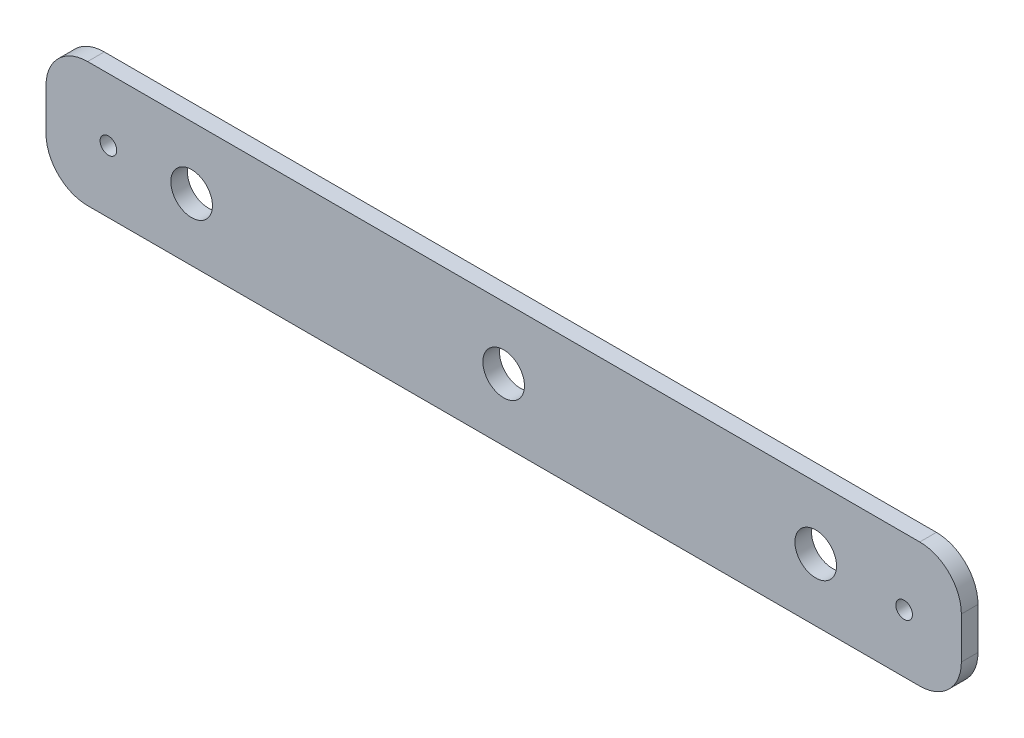
ISO-10303-21;
HEADER;
FILE_DESCRIPTION(('STEP AP214'),'2;1');
FILE_NAME('part.step','',(''),(''),'','','');
FILE_SCHEMA(('AUTOMOTIVE_DESIGN { 1 0 10303 214 1 1 1 1 }'));
ENDSEC;
DATA;
#1=APPLICATION_CONTEXT('core data for automotive mechanical design processes');
#2=APPLICATION_PROTOCOL_DEFINITION('international standard','automotive_design',2000,#1);
#3=PRODUCT_CONTEXT('',#1,'mechanical');
#4=PRODUCT('Part','Part','',(#3));
#5=PRODUCT_RELATED_PRODUCT_CATEGORY('part','',(#4));
#6=PRODUCT_DEFINITION_FORMATION('','',#4);
#7=PRODUCT_DEFINITION_CONTEXT('part definition',#1,'design');
#8=PRODUCT_DEFINITION('design','',#6,#7);
#9=PRODUCT_DEFINITION_SHAPE('','',#8);
#10=(LENGTH_UNIT() NAMED_UNIT(*) SI_UNIT(.MILLI.,.METRE.));
#11=(NAMED_UNIT(*) PLANE_ANGLE_UNIT() SI_UNIT($,.RADIAN.));
#12=(NAMED_UNIT(*) SI_UNIT($,.STERADIAN.) SOLID_ANGLE_UNIT());
#13=UNCERTAINTY_MEASURE_WITH_UNIT(LENGTH_MEASURE(1.E-05),#10,'distance_accuracy_value','');
#14=(GEOMETRIC_REPRESENTATION_CONTEXT(3) GLOBAL_UNCERTAINTY_ASSIGNED_CONTEXT((#13)) GLOBAL_UNIT_ASSIGNED_CONTEXT((#10,
#11,#12)) REPRESENTATION_CONTEXT('',''));
#15=CARTESIAN_POINT('',(0.,0.,0.));
#16=DIRECTION('',(0.,0.,1.));
#17=DIRECTION('',(1.,0.,0.));
#18=AXIS2_PLACEMENT_3D('',#15,#16,#17);
#19=CARTESIAN_POINT('',(0.,0.,4.));
#20=DIRECTION('',(0.,0.,-1.));
#21=DIRECTION('',(-1.,0.,0.));
#22=AXIS2_PLACEMENT_3D('',#19,#20,#21);
#23=PLANE('',#22);
#24=CARTESIAN_POINT('',(-185.,-15.,4.));
#25=DIRECTION('',(0.,0.,1.));
#26=DIRECTION('',(1.,0.,0.));
#27=AXIS2_PLACEMENT_3D('',#24,#25,#26);
#28=CIRCLE('',#27,4.99999999999999);
#29=CARTESIAN_POINT('',(-180.,-15.,4.));
#30=VERTEX_POINT('',#29);
#31=EDGE_CURVE('E165',#30,#30,#28,.T.);
#32=ORIENTED_EDGE('',*,*,#31,.F.);
#33=EDGE_LOOP('',(#32));
#34=FACE_BOUND('',#33,.T.);
#35=CARTESIAN_POINT('',(-110.,-15.,4.));
#36=DIRECTION('',(0.,0.,1.));
#37=DIRECTION('',(1.,0.,0.));
#38=AXIS2_PLACEMENT_3D('',#35,#36,#37);
#39=CIRCLE('',#38,5.);
#40=CARTESIAN_POINT('',(-105.,-15.,4.));
#41=VERTEX_POINT('',#40);
#42=EDGE_CURVE('E349',#41,#41,#39,.T.);
#43=ORIENTED_EDGE('',*,*,#42,.F.);
#44=EDGE_LOOP('',(#43));
#45=FACE_BOUND('',#44,.T.);
#46=CARTESIAN_POINT('',(-35.,-15.,4.));
#47=DIRECTION('',(0.,0.,1.));
#48=DIRECTION('',(1.,0.,0.));
#49=AXIS2_PLACEMENT_3D('',#46,#47,#48);
#50=CIRCLE('',#49,5.);
#51=CARTESIAN_POINT('',(-30.,-15.,4.));
#52=VERTEX_POINT('',#51);
#53=EDGE_CURVE('E352',#52,#52,#50,.T.);
#54=ORIENTED_EDGE('',*,*,#53,.F.);
#55=EDGE_LOOP('',(#54));
#56=FACE_BOUND('',#55,.T.);
#57=DIRECTION('',(0.,1.,0.));
#58=VECTOR('',#57,1.);
#59=CARTESIAN_POINT('',(0.,0.,4.));
#60=LINE('',#59,#58);
#61=CARTESIAN_POINT('',(0.,-20.,4.));
#62=VERTEX_POINT('',#61);
#63=CARTESIAN_POINT('',(0.,-10.,4.));
#64=VERTEX_POINT('',#63);
#65=EDGE_CURVE('E139',#62,#64,#60,.T.);
#66=ORIENTED_EDGE('',*,*,#65,.T.);
#67=CARTESIAN_POINT('',(-10.,-10.,4.));
#68=DIRECTION('',(0.,0.,-1.));
#69=DIRECTION('',(-1.,0.,0.));
#70=AXIS2_PLACEMENT_3D('',#67,#68,#69);
#71=CIRCLE('',#70,10.);
#72=CARTESIAN_POINT('',(-10.,0.,4.));
#73=VERTEX_POINT('',#72);
#74=EDGE_CURVE('E154',#64,#73,#71,.F.);
#75=ORIENTED_EDGE('',*,*,#74,.T.);
#76=DIRECTION('',(-1.,0.,0.));
#77=VECTOR('',#76,1.);
#78=CARTESIAN_POINT('',(0.,0.,4.));
#79=LINE('',#78,#77);
#80=CARTESIAN_POINT('',(-210.,0.,4.));
#81=VERTEX_POINT('',#80);
#82=EDGE_CURVE('E121',#73,#81,#79,.T.);
#83=ORIENTED_EDGE('',*,*,#82,.T.);
#84=CARTESIAN_POINT('',(-210.,-10.,4.));
#85=DIRECTION('',(0.,0.,-1.));
#86=DIRECTION('',(-1.,0.,0.));
#87=AXIS2_PLACEMENT_3D('',#84,#85,#86);
#88=CIRCLE('',#87,10.);
#89=CARTESIAN_POINT('',(-220.,-10.,4.));
#90=VERTEX_POINT('',#89);
#91=EDGE_CURVE('E149',#81,#90,#88,.F.);
#92=ORIENTED_EDGE('',*,*,#91,.T.);
#93=DIRECTION('',(0.,-1.,0.));
#94=VECTOR('',#93,1.);
#95=CARTESIAN_POINT('',(-220.,0.,4.));
#96=LINE('',#95,#94);
#97=CARTESIAN_POINT('',(-220.,-20.,4.));
#98=VERTEX_POINT('',#97);
#99=EDGE_CURVE('E189',#90,#98,#96,.T.);
#100=ORIENTED_EDGE('',*,*,#99,.T.);
#101=CARTESIAN_POINT('',(-210.,-20.,4.));
#102=DIRECTION('',(0.,0.,-1.));
#103=DIRECTION('',(-1.,0.,0.));
#104=AXIS2_PLACEMENT_3D('',#101,#102,#103);
#105=CIRCLE('',#104,10.);
#106=CARTESIAN_POINT('',(-210.,-30.,4.));
#107=VERTEX_POINT('',#106);
#108=EDGE_CURVE('E57',#98,#107,#105,.F.);
#109=ORIENTED_EDGE('',*,*,#108,.T.);
#110=DIRECTION('',(1.,0.,0.));
#111=VECTOR('',#110,1.);
#112=CARTESIAN_POINT('',(0.,-30.,4.));
#113=LINE('',#112,#111);
#114=CARTESIAN_POINT('',(-10.,-30.,4.));
#115=VERTEX_POINT('',#114);
#116=EDGE_CURVE('E140',#107,#115,#113,.T.);
#117=ORIENTED_EDGE('',*,*,#116,.T.);
#118=CARTESIAN_POINT('',(-10.,-20.,4.));
#119=DIRECTION('',(0.,0.,-1.));
#120=DIRECTION('',(-1.,0.,0.));
#121=AXIS2_PLACEMENT_3D('',#118,#119,#120);
#122=CIRCLE('',#121,10.);
#123=EDGE_CURVE('E152',#115,#62,#122,.F.);
#124=ORIENTED_EDGE('',*,*,#123,.T.);
#125=EDGE_LOOP('',(#66,#75,#83,#92,#100,#109,#117,#124));
#126=FACE_BOUND('',#125,.T.);
#127=CARTESIAN_POINT('',(-205.,-15.,4.));
#128=DIRECTION('',(0.,0.,1.));
#129=DIRECTION('',(1.,0.,0.));
#130=AXIS2_PLACEMENT_3D('',#127,#128,#129);
#131=CIRCLE('',#130,2.);
#132=CARTESIAN_POINT('',(-203.,-15.,4.));
#133=VERTEX_POINT('',#132);
#134=EDGE_CURVE('E134',#133,#133,#131,.T.);
#135=ORIENTED_EDGE('',*,*,#134,.F.);
#136=EDGE_LOOP('',(#135));
#137=FACE_BOUND('',#136,.T.);
#138=CARTESIAN_POINT('',(-13.75,-16.,4.));
#139=DIRECTION('',(0.,0.,1.));
#140=DIRECTION('',(1.,0.,0.));
#141=AXIS2_PLACEMENT_3D('',#138,#139,#140);
#142=CIRCLE('',#141,2.);
#143=CARTESIAN_POINT('',(-11.75,-16.,4.));
#144=VERTEX_POINT('',#143);
#145=EDGE_CURVE('E174',#144,#144,#142,.T.);
#146=ORIENTED_EDGE('',*,*,#145,.F.);
#147=EDGE_LOOP('',(#146));
#148=FACE_BOUND('',#147,.T.);
#149=ADVANCED_FACE('F33',(#34,#45,#56,#126,#137,#148),#23,.F.);
#150=CARTESIAN_POINT('',(0.,0.,0.));
#151=DIRECTION('',(0.,0.,-1.));
#152=DIRECTION('',(-1.,0.,0.));
#153=AXIS2_PLACEMENT_3D('',#150,#151,#152);
#154=PLANE('',#153);
#155=CARTESIAN_POINT('',(-185.,-15.,0.));
#156=DIRECTION('',(0.,0.,-1.));
#157=DIRECTION('',(-1.,0.,0.));
#158=AXIS2_PLACEMENT_3D('',#155,#156,#157);
#159=CIRCLE('',#158,4.99999999999999);
#160=CARTESIAN_POINT('',(-190.,-15.,0.));
#161=VERTEX_POINT('',#160);
#162=EDGE_CURVE('E37',#161,#161,#159,.T.);
#163=ORIENTED_EDGE('',*,*,#162,.F.);
#164=EDGE_LOOP('',(#163));
#165=FACE_BOUND('',#164,.T.);
#166=CARTESIAN_POINT('',(-110.,-15.,0.));
#167=DIRECTION('',(0.,0.,-1.));
#168=DIRECTION('',(-1.,0.,0.));
#169=AXIS2_PLACEMENT_3D('',#166,#167,#168);
#170=CIRCLE('',#169,5.);
#171=CARTESIAN_POINT('',(-115.,-15.,0.));
#172=VERTEX_POINT('',#171);
#173=EDGE_CURVE('E164',#172,#172,#170,.T.);
#174=ORIENTED_EDGE('',*,*,#173,.F.);
#175=EDGE_LOOP('',(#174));
#176=FACE_BOUND('',#175,.T.);
#177=CARTESIAN_POINT('',(-35.,-15.,0.));
#178=DIRECTION('',(0.,0.,-1.));
#179=DIRECTION('',(-1.,0.,0.));
#180=AXIS2_PLACEMENT_3D('',#177,#178,#179);
#181=CIRCLE('',#180,5.);
#182=CARTESIAN_POINT('',(-40.,-15.,0.));
#183=VERTEX_POINT('',#182);
#184=EDGE_CURVE('E162',#183,#183,#181,.T.);
#185=ORIENTED_EDGE('',*,*,#184,.F.);
#186=EDGE_LOOP('',(#185));
#187=FACE_BOUND('',#186,.T.);
#188=CARTESIAN_POINT('',(-205.,-15.,0.));
#189=DIRECTION('',(0.,0.,1.));
#190=DIRECTION('',(1.,0.,0.));
#191=AXIS2_PLACEMENT_3D('',#188,#189,#190);
#192=CIRCLE('',#191,2.);
#193=CARTESIAN_POINT('',(-203.,-15.,0.));
#194=VERTEX_POINT('',#193);
#195=EDGE_CURVE('E178',#194,#194,#192,.T.);
#196=ORIENTED_EDGE('',*,*,#195,.T.);
#197=EDGE_LOOP('',(#196));
#198=FACE_BOUND('',#197,.T.);
#199=DIRECTION('',(-1.,0.,0.));
#200=VECTOR('',#199,1.);
#201=CARTESIAN_POINT('',(0.,0.,0.));
#202=LINE('',#201,#200);
#203=CARTESIAN_POINT('',(-10.,0.,0.));
#204=VERTEX_POINT('',#203);
#205=CARTESIAN_POINT('',(-210.,0.,0.));
#206=VERTEX_POINT('',#205);
#207=EDGE_CURVE('E118',#204,#206,#202,.T.);
#208=ORIENTED_EDGE('',*,*,#207,.F.);
#209=CARTESIAN_POINT('',(-10.,-10.,0.));
#210=DIRECTION('',(0.,0.,-1.));
#211=DIRECTION('',(-1.,0.,0.));
#212=AXIS2_PLACEMENT_3D('',#209,#210,#211);
#213=CIRCLE('',#212,10.);
#214=CARTESIAN_POINT('',(0.,-10.,0.));
#215=VERTEX_POINT('',#214);
#216=EDGE_CURVE('E101',#204,#215,#213,.T.);
#217=ORIENTED_EDGE('',*,*,#216,.T.);
#218=DIRECTION('',(0.,1.,0.));
#219=VECTOR('',#218,1.);
#220=CARTESIAN_POINT('',(0.,0.,0.));
#221=LINE('',#220,#219);
#222=CARTESIAN_POINT('',(0.,-20.,0.));
#223=VERTEX_POINT('',#222);
#224=EDGE_CURVE('E129',#223,#215,#221,.T.);
#225=ORIENTED_EDGE('',*,*,#224,.F.);
#226=CARTESIAN_POINT('',(-10.,-20.,0.));
#227=DIRECTION('',(0.,0.,-1.));
#228=DIRECTION('',(-1.,0.,0.));
#229=AXIS2_PLACEMENT_3D('',#226,#227,#228);
#230=CIRCLE('',#229,10.);
#231=CARTESIAN_POINT('',(-10.,-30.,0.));
#232=VERTEX_POINT('',#231);
#233=EDGE_CURVE('E112',#223,#232,#230,.T.);
#234=ORIENTED_EDGE('',*,*,#233,.T.);
#235=DIRECTION('',(1.,0.,0.));
#236=VECTOR('',#235,1.);
#237=CARTESIAN_POINT('',(0.,-30.,0.));
#238=LINE('',#237,#236);
#239=CARTESIAN_POINT('',(-210.,-30.,0.));
#240=VERTEX_POINT('',#239);
#241=EDGE_CURVE('E132',#240,#232,#238,.T.);
#242=ORIENTED_EDGE('',*,*,#241,.F.);
#243=CARTESIAN_POINT('',(-210.,-20.,0.));
#244=DIRECTION('',(0.,0.,-1.));
#245=DIRECTION('',(-1.,0.,0.));
#246=AXIS2_PLACEMENT_3D('',#243,#244,#245);
#247=CIRCLE('',#246,10.);
#248=CARTESIAN_POINT('',(-220.,-20.,0.));
#249=VERTEX_POINT('',#248);
#250=EDGE_CURVE('E143',#240,#249,#247,.T.);
#251=ORIENTED_EDGE('',*,*,#250,.T.);
#252=DIRECTION('',(0.,-1.,0.));
#253=VECTOR('',#252,1.);
#254=CARTESIAN_POINT('',(-220.,0.,0.));
#255=LINE('',#254,#253);
#256=CARTESIAN_POINT('',(-220.,-10.,0.));
#257=VERTEX_POINT('',#256);
#258=EDGE_CURVE('E128',#257,#249,#255,.T.);
#259=ORIENTED_EDGE('',*,*,#258,.F.);
#260=CARTESIAN_POINT('',(-210.,-10.,0.));
#261=DIRECTION('',(0.,0.,-1.));
#262=DIRECTION('',(-1.,0.,0.));
#263=AXIS2_PLACEMENT_3D('',#260,#261,#262);
#264=CIRCLE('',#263,10.);
#265=EDGE_CURVE('E122',#257,#206,#264,.T.);
#266=ORIENTED_EDGE('',*,*,#265,.T.);
#267=EDGE_LOOP('',(#208,#217,#225,#234,#242,#251,#259,#266));
#268=FACE_BOUND('',#267,.T.);
#269=CARTESIAN_POINT('',(-13.75,-16.,0.));
#270=DIRECTION('',(0.,0.,1.));
#271=DIRECTION('',(1.,0.,0.));
#272=AXIS2_PLACEMENT_3D('',#269,#270,#271);
#273=CIRCLE('',#272,2.);
#274=CARTESIAN_POINT('',(-11.75,-16.,0.));
#275=VERTEX_POINT('',#274);
#276=EDGE_CURVE('E170',#275,#275,#273,.T.);
#277=ORIENTED_EDGE('',*,*,#276,.T.);
#278=EDGE_LOOP('',(#277));
#279=FACE_BOUND('',#278,.T.);
#280=ADVANCED_FACE('F125',(#165,#176,#187,#198,#268,#279),#154,.T.);
#281=CARTESIAN_POINT('',(0.,0.,4.));
#282=DIRECTION('',(-1.,0.,0.));
#283=DIRECTION('',(0.,-1.,0.));
#284=AXIS2_PLACEMENT_3D('',#281,#282,#283);
#285=PLANE('',#284);
#286=ORIENTED_EDGE('',*,*,#224,.T.);
#287=DIRECTION('',(0.,0.,-1.));
#288=VECTOR('',#287,1.);
#289=CARTESIAN_POINT('',(0.,-10.,4.));
#290=LINE('',#289,#288);
#291=EDGE_CURVE('E106',#215,#64,#290,.F.);
#292=ORIENTED_EDGE('',*,*,#291,.T.);
#293=ORIENTED_EDGE('',*,*,#65,.F.);
#294=DIRECTION('',(0.,0.,-1.));
#295=VECTOR('',#294,1.);
#296=CARTESIAN_POINT('',(0.,-20.,4.));
#297=LINE('',#296,#295);
#298=EDGE_CURVE('E111',#62,#223,#297,.T.);
#299=ORIENTED_EDGE('',*,*,#298,.T.);
#300=EDGE_LOOP('',(#286,#292,#293,#299));
#301=FACE_BOUND('',#300,.T.);
#302=ADVANCED_FACE('F198',(#301),#285,.F.);
#303=CARTESIAN_POINT('',(0.,0.,4.));
#304=DIRECTION('',(0.,-1.,0.));
#305=DIRECTION('',(0.,0.,-1.));
#306=AXIS2_PLACEMENT_3D('',#303,#304,#305);
#307=PLANE('',#306);
#308=ORIENTED_EDGE('',*,*,#82,.F.);
#309=DIRECTION('',(0.,0.,-1.));
#310=VECTOR('',#309,1.);
#311=CARTESIAN_POINT('',(-10.,0.,4.));
#312=LINE('',#311,#310);
#313=EDGE_CURVE('E105',#73,#204,#312,.T.);
#314=ORIENTED_EDGE('',*,*,#313,.T.);
#315=ORIENTED_EDGE('',*,*,#207,.T.);
#316=DIRECTION('',(0.,0.,-1.));
#317=VECTOR('',#316,1.);
#318=CARTESIAN_POINT('',(-210.,0.,4.));
#319=LINE('',#318,#317);
#320=EDGE_CURVE('E123',#206,#81,#319,.F.);
#321=ORIENTED_EDGE('',*,*,#320,.T.);
#322=EDGE_LOOP('',(#308,#314,#315,#321));
#323=FACE_BOUND('',#322,.T.);
#324=ADVANCED_FACE('F117',(#323),#307,.F.);
#325=CARTESIAN_POINT('',(-220.,0.,4.));
#326=DIRECTION('',(1.,0.,0.));
#327=DIRECTION('',(0.,0.,-1.));
#328=AXIS2_PLACEMENT_3D('',#325,#326,#327);
#329=PLANE('',#328);
#330=ORIENTED_EDGE('',*,*,#258,.T.);
#331=DIRECTION('',(0.,0.,-1.));
#332=VECTOR('',#331,1.);
#333=CARTESIAN_POINT('',(-220.,-20.,4.));
#334=LINE('',#333,#332);
#335=EDGE_CURVE('E11',#249,#98,#334,.F.);
#336=ORIENTED_EDGE('',*,*,#335,.T.);
#337=ORIENTED_EDGE('',*,*,#99,.F.);
#338=DIRECTION('',(0.,0.,-1.));
#339=VECTOR('',#338,1.);
#340=CARTESIAN_POINT('',(-220.,-10.,4.));
#341=LINE('',#340,#339);
#342=EDGE_CURVE('E42',#90,#257,#341,.T.);
#343=ORIENTED_EDGE('',*,*,#342,.T.);
#344=EDGE_LOOP('',(#330,#336,#337,#343));
#345=FACE_BOUND('',#344,.T.);
#346=ADVANCED_FACE('F205',(#345),#329,.F.);
#347=CARTESIAN_POINT('',(0.,-30.,4.));
#348=DIRECTION('',(0.,1.,0.));
#349=DIRECTION('',(-1.,0.,0.));
#350=AXIS2_PLACEMENT_3D('',#347,#348,#349);
#351=PLANE('',#350);
#352=ORIENTED_EDGE('',*,*,#241,.T.);
#353=DIRECTION('',(0.,0.,-1.));
#354=VECTOR('',#353,1.);
#355=CARTESIAN_POINT('',(-10.,-30.,4.));
#356=LINE('',#355,#354);
#357=EDGE_CURVE('E50',#232,#115,#356,.F.);
#358=ORIENTED_EDGE('',*,*,#357,.T.);
#359=ORIENTED_EDGE('',*,*,#116,.F.);
#360=DIRECTION('',(0.,0.,-1.));
#361=VECTOR('',#360,1.);
#362=CARTESIAN_POINT('',(-210.,-30.,4.));
#363=LINE('',#362,#361);
#364=EDGE_CURVE('E156',#107,#240,#363,.T.);
#365=ORIENTED_EDGE('',*,*,#364,.T.);
#366=EDGE_LOOP('',(#352,#358,#359,#365));
#367=FACE_BOUND('',#366,.T.);
#368=ADVANCED_FACE('F200',(#367),#351,.F.);
#369=CARTESIAN_POINT('',(-205.,-15.,4.));
#370=DIRECTION('',(0.,0.,-1.));
#371=DIRECTION('',(-1.,0.,0.));
#372=AXIS2_PLACEMENT_3D('',#369,#370,#371);
#373=CYLINDRICAL_SURFACE('',#372,2.);
#374=ORIENTED_EDGE('',*,*,#134,.T.);
#375=EDGE_LOOP('',(#374));
#376=FACE_BOUND('',#375,.T.);
#377=ORIENTED_EDGE('',*,*,#195,.F.);
#378=EDGE_LOOP('',(#377));
#379=FACE_BOUND('',#378,.T.);
#380=ADVANCED_FACE('F230',(#376,#379),#373,.F.);
#381=CARTESIAN_POINT('',(-13.75,-16.,4.));
#382=DIRECTION('',(0.,0.,-1.));
#383=DIRECTION('',(-1.,0.,0.));
#384=AXIS2_PLACEMENT_3D('',#381,#382,#383);
#385=CYLINDRICAL_SURFACE('',#384,2.);
#386=ORIENTED_EDGE('',*,*,#145,.T.);
#387=EDGE_LOOP('',(#386));
#388=FACE_BOUND('',#387,.T.);
#389=ORIENTED_EDGE('',*,*,#276,.F.);
#390=EDGE_LOOP('',(#389));
#391=FACE_BOUND('',#390,.T.);
#392=ADVANCED_FACE('F243',(#388,#391),#385,.F.);
#393=CARTESIAN_POINT('',(-10.,-10.,4.));
#394=DIRECTION('',(0.,0.,-1.));
#395=DIRECTION('',(-1.,0.,0.));
#396=AXIS2_PLACEMENT_3D('',#393,#394,#395);
#397=CYLINDRICAL_SURFACE('',#396,10.);
#398=ORIENTED_EDGE('',*,*,#74,.F.);
#399=ORIENTED_EDGE('',*,*,#291,.F.);
#400=ORIENTED_EDGE('',*,*,#216,.F.);
#401=ORIENTED_EDGE('',*,*,#313,.F.);
#402=EDGE_LOOP('',(#398,#399,#400,#401));
#403=FACE_BOUND('',#402,.T.);
#404=ADVANCED_FACE('F104',(#403),#397,.T.);
#405=CARTESIAN_POINT('',(-10.,-20.,4.));
#406=DIRECTION('',(0.,0.,-1.));
#407=DIRECTION('',(-1.,0.,0.));
#408=AXIS2_PLACEMENT_3D('',#405,#406,#407);
#409=CYLINDRICAL_SURFACE('',#408,10.);
#410=ORIENTED_EDGE('',*,*,#123,.F.);
#411=ORIENTED_EDGE('',*,*,#357,.F.);
#412=ORIENTED_EDGE('',*,*,#233,.F.);
#413=ORIENTED_EDGE('',*,*,#298,.F.);
#414=EDGE_LOOP('',(#410,#411,#412,#413));
#415=FACE_BOUND('',#414,.T.);
#416=ADVANCED_FACE('F196',(#415),#409,.T.);
#417=CARTESIAN_POINT('',(-210.,-20.,4.));
#418=DIRECTION('',(0.,0.,-1.));
#419=DIRECTION('',(-1.,0.,0.));
#420=AXIS2_PLACEMENT_3D('',#417,#418,#419);
#421=CYLINDRICAL_SURFACE('',#420,10.);
#422=ORIENTED_EDGE('',*,*,#108,.F.);
#423=ORIENTED_EDGE('',*,*,#335,.F.);
#424=ORIENTED_EDGE('',*,*,#250,.F.);
#425=ORIENTED_EDGE('',*,*,#364,.F.);
#426=EDGE_LOOP('',(#422,#423,#424,#425));
#427=FACE_BOUND('',#426,.T.);
#428=ADVANCED_FACE('F202',(#427),#421,.T.);
#429=CARTESIAN_POINT('',(-210.,-10.,4.));
#430=DIRECTION('',(0.,0.,-1.));
#431=DIRECTION('',(-1.,0.,0.));
#432=AXIS2_PLACEMENT_3D('',#429,#430,#431);
#433=CYLINDRICAL_SURFACE('',#432,10.);
#434=ORIENTED_EDGE('',*,*,#91,.F.);
#435=ORIENTED_EDGE('',*,*,#320,.F.);
#436=ORIENTED_EDGE('',*,*,#265,.F.);
#437=ORIENTED_EDGE('',*,*,#342,.F.);
#438=EDGE_LOOP('',(#434,#435,#436,#437));
#439=FACE_BOUND('',#438,.T.);
#440=ADVANCED_FACE('F35',(#439),#433,.T.);
#441=CARTESIAN_POINT('',(-35.,-15.,-6.));
#442=DIRECTION('',(0.,0.,1.));
#443=DIRECTION('',(1.,0.,0.));
#444=AXIS2_PLACEMENT_3D('',#441,#442,#443);
#445=CYLINDRICAL_SURFACE('',#444,5.);
#446=ORIENTED_EDGE('',*,*,#184,.T.);
#447=EDGE_LOOP('',(#446));
#448=FACE_BOUND('',#447,.T.);
#449=ORIENTED_EDGE('',*,*,#53,.T.);
#450=EDGE_LOOP('',(#449));
#451=FACE_BOUND('',#450,.T.);
#452=ADVANCED_FACE('F211',(#448,#451),#445,.F.);
#453=CARTESIAN_POINT('',(-110.,-15.,-6.));
#454=DIRECTION('',(0.,0.,1.));
#455=DIRECTION('',(1.,0.,0.));
#456=AXIS2_PLACEMENT_3D('',#453,#454,#455);
#457=CYLINDRICAL_SURFACE('',#456,5.);
#458=ORIENTED_EDGE('',*,*,#173,.T.);
#459=EDGE_LOOP('',(#458));
#460=FACE_BOUND('',#459,.T.);
#461=ORIENTED_EDGE('',*,*,#42,.T.);
#462=EDGE_LOOP('',(#461));
#463=FACE_BOUND('',#462,.T.);
#464=ADVANCED_FACE('F216',(#460,#463),#457,.F.);
#465=CARTESIAN_POINT('',(-185.,-15.,-6.));
#466=DIRECTION('',(0.,0.,1.));
#467=DIRECTION('',(1.,0.,0.));
#468=AXIS2_PLACEMENT_3D('',#465,#466,#467);
#469=CYLINDRICAL_SURFACE('',#468,4.99999999999999);
#470=ORIENTED_EDGE('',*,*,#162,.T.);
#471=EDGE_LOOP('',(#470));
#472=FACE_BOUND('',#471,.T.);
#473=ORIENTED_EDGE('',*,*,#31,.T.);
#474=EDGE_LOOP('',(#473));
#475=FACE_BOUND('',#474,.T.);
#476=ADVANCED_FACE('F284',(#472,#475),#469,.F.);
#477=CLOSED_SHELL('',(#149,#280,#302,#324,#346,#368,#380,#392,#404,#416,#428,#440,#452,#464,#476));
#478=MANIFOLD_SOLID_BREP('B2',#477);
#479=ADVANCED_BREP_SHAPE_REPRESENTATION('',(#18,#478),#14);
#480=SHAPE_DEFINITION_REPRESENTATION(#9,#479);
ENDSEC;
END-ISO-10303-21;
